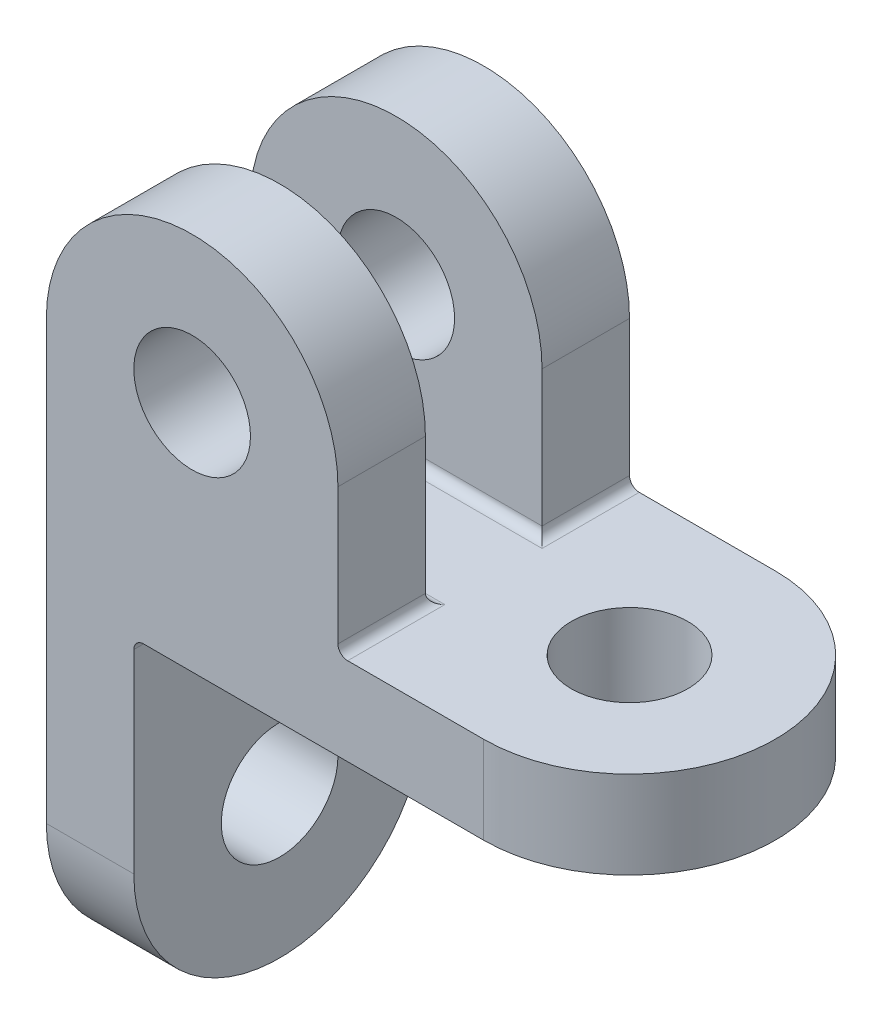
ISO-10303-21;
HEADER;
FILE_DESCRIPTION(('STEP AP214'),'2;1');
FILE_NAME('part.step','',(''),(''),'','','');
FILE_SCHEMA(('AUTOMOTIVE_DESIGN { 1 0 10303 214 1 1 1 1 }'));
ENDSEC;
DATA;
#1=APPLICATION_CONTEXT('core data for automotive mechanical design processes');
#2=APPLICATION_PROTOCOL_DEFINITION('international standard','automotive_design',2000,#1);
#3=PRODUCT_CONTEXT('',#1,'mechanical');
#4=PRODUCT('Part','Part','',(#3));
#5=PRODUCT_RELATED_PRODUCT_CATEGORY('part','',(#4));
#6=PRODUCT_DEFINITION_FORMATION('','',#4);
#7=PRODUCT_DEFINITION_CONTEXT('part definition',#1,'design');
#8=PRODUCT_DEFINITION('design','',#6,#7);
#9=PRODUCT_DEFINITION_SHAPE('','',#8);
#10=(LENGTH_UNIT() NAMED_UNIT(*) SI_UNIT(.MILLI.,.METRE.));
#11=(NAMED_UNIT(*) PLANE_ANGLE_UNIT() SI_UNIT($,.RADIAN.));
#12=(NAMED_UNIT(*) SI_UNIT($,.STERADIAN.) SOLID_ANGLE_UNIT());
#13=UNCERTAINTY_MEASURE_WITH_UNIT(LENGTH_MEASURE(1.E-05),#10,'distance_accuracy_value','');
#14=(GEOMETRIC_REPRESENTATION_CONTEXT(3) GLOBAL_UNCERTAINTY_ASSIGNED_CONTEXT((#13)) GLOBAL_UNIT_ASSIGNED_CONTEXT((#10,
#11,#12)) REPRESENTATION_CONTEXT('',''));
#15=CARTESIAN_POINT('',(0.,0.,0.));
#16=DIRECTION('',(0.,0.,1.));
#17=DIRECTION('',(1.,0.,0.));
#18=AXIS2_PLACEMENT_3D('',#15,#16,#17);
#19=CARTESIAN_POINT('',(0.,15.,0.));
#20=DIRECTION('',(-1.,0.,0.));
#21=DIRECTION('',(0.,-1.,0.));
#22=AXIS2_PLACEMENT_3D('',#19,#20,#21);
#23=CYLINDRICAL_SURFACE('',#22,15.);
#24=DIRECTION('',(-1.,0.,0.));
#25=VECTOR('',#24,1.);
#26=CARTESIAN_POINT('',(0.,15.,15.));
#27=LINE('',#26,#25);
#28=CARTESIAN_POINT('',(0.,15.,15.));
#29=VERTEX_POINT('',#28);
#30=CARTESIAN_POINT('',(9.,15.,15.));
#31=VERTEX_POINT('',#30);
#32=EDGE_CURVE('E293',#29,#31,#27,.F.);
#33=ORIENTED_EDGE('',*,*,#32,.F.);
#34=CARTESIAN_POINT('',(0.,15.,0.));
#35=DIRECTION('',(-1.,0.,0.));
#36=DIRECTION('',(0.,0.,1.));
#37=AXIS2_PLACEMENT_3D('',#34,#35,#36);
#38=CIRCLE('',#37,15.);
#39=CARTESIAN_POINT('',(0.,15.,-15.));
#40=VERTEX_POINT('',#39);
#41=EDGE_CURVE('E299',#40,#29,#38,.T.);
#42=ORIENTED_EDGE('',*,*,#41,.F.);
#43=DIRECTION('',(1.,0.,0.));
#44=VECTOR('',#43,1.);
#45=CARTESIAN_POINT('',(0.,15.,-15.));
#46=LINE('',#45,#44);
#47=CARTESIAN_POINT('',(9.,15.,-15.));
#48=VERTEX_POINT('',#47);
#49=EDGE_CURVE('E175',#48,#40,#46,.F.);
#50=ORIENTED_EDGE('',*,*,#49,.F.);
#51=CARTESIAN_POINT('',(9.,15.,0.));
#52=DIRECTION('',(1.,0.,0.));
#53=DIRECTION('',(0.,1.,0.));
#54=AXIS2_PLACEMENT_3D('',#51,#52,#53);
#55=CIRCLE('',#54,15.);
#56=EDGE_CURVE('E302',#31,#48,#55,.T.);
#57=ORIENTED_EDGE('',*,*,#56,.F.);
#58=EDGE_LOOP('',(#33,#42,#50,#57));
#59=FACE_BOUND('',#58,.T.);
#60=ADVANCED_FACE('F49',(#59),#23,.T.);
#61=CARTESIAN_POINT('',(45.,36.,0.));
#62=DIRECTION('',(0.,-1.,0.));
#63=DIRECTION('',(1.,0.,0.));
#64=AXIS2_PLACEMENT_3D('',#61,#62,#63);
#65=CYLINDRICAL_SURFACE('',#64,15.);
#66=DIRECTION('',(0.,-1.,0.));
#67=VECTOR('',#66,1.);
#68=CARTESIAN_POINT('',(45.,0.,15.));
#69=LINE('',#68,#67);
#70=CARTESIAN_POINT('',(45.,36.,15.));
#71=VERTEX_POINT('',#70);
#72=CARTESIAN_POINT('',(45.,45.,15.));
#73=VERTEX_POINT('',#72);
#74=EDGE_CURVE('E278',#71,#73,#69,.F.);
#75=ORIENTED_EDGE('',*,*,#74,.F.);
#76=CARTESIAN_POINT('',(45.,36.,0.));
#77=DIRECTION('',(0.,-1.,0.));
#78=DIRECTION('',(1.,0.,0.));
#79=AXIS2_PLACEMENT_3D('',#76,#77,#78);
#80=CIRCLE('',#79,15.);
#81=CARTESIAN_POINT('',(45.,36.,-15.));
#82=VERTEX_POINT('',#81);
#83=EDGE_CURVE('E286',#82,#71,#80,.T.);
#84=ORIENTED_EDGE('',*,*,#83,.F.);
#85=DIRECTION('',(0.,1.,0.));
#86=VECTOR('',#85,1.);
#87=CARTESIAN_POINT('',(45.,36.,-15.));
#88=LINE('',#87,#86);
#89=CARTESIAN_POINT('',(45.,45.,-15.));
#90=VERTEX_POINT('',#89);
#91=EDGE_CURVE('E282',#90,#82,#88,.F.);
#92=ORIENTED_EDGE('',*,*,#91,.F.);
#93=CARTESIAN_POINT('',(45.,45.,0.));
#94=DIRECTION('',(0.,1.,0.));
#95=DIRECTION('',(-1.,0.,0.));
#96=AXIS2_PLACEMENT_3D('',#93,#94,#95);
#97=CIRCLE('',#96,15.);
#98=EDGE_CURVE('E289',#73,#90,#97,.T.);
#99=ORIENTED_EDGE('',*,*,#98,.F.);
#100=EDGE_LOOP('',(#75,#84,#92,#99));
#101=FACE_BOUND('',#100,.T.);
#102=ADVANCED_FACE('F404',(#101),#65,.T.);
#103=CARTESIAN_POINT('',(0.,45.,15.));
#104=DIRECTION('',(0.,1.,0.));
#105=DIRECTION('',(-1.,0.,0.));
#106=AXIS2_PLACEMENT_3D('',#103,#104,#105);
#107=PLANE('',#106);
#108=CARTESIAN_POINT('',(45.,45.,0.));
#109=DIRECTION('',(0.,1.,0.));
#110=DIRECTION('',(0.,0.,1.));
#111=AXIS2_PLACEMENT_3D('',#108,#109,#110);
#112=CIRCLE('',#111,5.99999999999998);
#113=CARTESIAN_POINT('',(45.,45.,5.99999999999998));
#114=VERTEX_POINT('',#113);
#115=EDGE_CURVE('E312',#114,#114,#112,.T.);
#116=ORIENTED_EDGE('',*,*,#115,.F.);
#117=EDGE_LOOP('',(#116));
#118=FACE_BOUND('',#117,.T.);
#119=DIRECTION('',(0.,0.,1.));
#120=VECTOR('',#119,1.);
#121=CARTESIAN_POINT('',(31.,45.,15.));
#122=LINE('',#121,#120);
#123=CARTESIAN_POINT('',(31.,45.,-15.));
#124=VERTEX_POINT('',#123);
#125=CARTESIAN_POINT('',(31.,45.,-5.));
#126=VERTEX_POINT('',#125);
#127=EDGE_CURVE('E73',#124,#126,#122,.T.);
#128=ORIENTED_EDGE('',*,*,#127,.T.);
#129=DIRECTION('',(1.,0.,0.));
#130=VECTOR('',#129,1.);
#131=CARTESIAN_POINT('',(0.,45.,-5.));
#132=LINE('',#131,#130);
#133=CARTESIAN_POINT('',(0.,45.,-5.));
#134=VERTEX_POINT('',#133);
#135=EDGE_CURVE('E351',#126,#134,#132,.F.);
#136=ORIENTED_EDGE('',*,*,#135,.T.);
#137=DIRECTION('',(0.,0.,-1.));
#138=VECTOR('',#137,1.);
#139=CARTESIAN_POINT('',(0.,45.,15.));
#140=LINE('',#139,#138);
#141=CARTESIAN_POINT('',(0.,45.,5.));
#142=VERTEX_POINT('',#141);
#143=EDGE_CURVE('E267',#142,#134,#140,.T.);
#144=ORIENTED_EDGE('',*,*,#143,.F.);
#145=DIRECTION('',(1.,0.,0.));
#146=VECTOR('',#145,1.);
#147=CARTESIAN_POINT('',(0.,45.,5.));
#148=LINE('',#147,#146);
#149=CARTESIAN_POINT('',(31.,45.,5.));
#150=VERTEX_POINT('',#149);
#151=EDGE_CURVE('E347',#142,#150,#148,.T.);
#152=ORIENTED_EDGE('',*,*,#151,.T.);
#153=DIRECTION('',(0.,0.,-1.));
#154=VECTOR('',#153,1.);
#155=CARTESIAN_POINT('',(31.,45.,15.));
#156=LINE('',#155,#154);
#157=CARTESIAN_POINT('',(31.,45.,15.));
#158=VERTEX_POINT('',#157);
#159=EDGE_CURVE('E337',#150,#158,#156,.F.);
#160=ORIENTED_EDGE('',*,*,#159,.T.);
#161=DIRECTION('',(1.,0.,0.));
#162=VECTOR('',#161,1.);
#163=CARTESIAN_POINT('',(0.,45.,15.));
#164=LINE('',#163,#162);
#165=EDGE_CURVE('E261',#158,#73,#164,.T.);
#166=ORIENTED_EDGE('',*,*,#165,.T.);
#167=ORIENTED_EDGE('',*,*,#98,.T.);
#168=DIRECTION('',(1.,0.,0.));
#169=VECTOR('',#168,1.);
#170=CARTESIAN_POINT('',(0.,45.,-15.));
#171=LINE('',#170,#169);
#172=EDGE_CURVE('E179',#124,#90,#171,.T.);
#173=ORIENTED_EDGE('',*,*,#172,.F.);
#174=EDGE_LOOP('',(#128,#136,#144,#152,#160,#166,#167,#173));
#175=FACE_BOUND('',#174,.T.);
#176=ADVANCED_FACE('F378',(#118,#175),#107,.T.);
#177=CARTESIAN_POINT('',(9.,0.,15.));
#178=DIRECTION('',(1.,0.,0.));
#179=DIRECTION('',(0.,1.,0.));
#180=AXIS2_PLACEMENT_3D('',#177,#178,#179);
#181=PLANE('',#180);
#182=CARTESIAN_POINT('',(9.,15.,0.));
#183=DIRECTION('',(1.,0.,0.));
#184=DIRECTION('',(0.,0.,-1.));
#185=AXIS2_PLACEMENT_3D('',#182,#183,#184);
#186=CIRCLE('',#185,5.99999999999999);
#187=CARTESIAN_POINT('',(9.,15.,-5.99999999999999));
#188=VERTEX_POINT('',#187);
#189=EDGE_CURVE('E311',#188,#188,#186,.T.);
#190=ORIENTED_EDGE('',*,*,#189,.F.);
#191=EDGE_LOOP('',(#190));
#192=FACE_BOUND('',#191,.T.);
#193=DIRECTION('',(0.,-1.,0.));
#194=VECTOR('',#193,1.);
#195=CARTESIAN_POINT('',(9.,0.,-15.));
#196=LINE('',#195,#194);
#197=CARTESIAN_POINT('',(8.99999999999999,35.,-15.));
#198=VERTEX_POINT('',#197);
#199=EDGE_CURVE('E254',#198,#48,#196,.T.);
#200=ORIENTED_EDGE('',*,*,#199,.F.);
#201=DIRECTION('',(0.,0.,-1.));
#202=VECTOR('',#201,1.);
#203=CARTESIAN_POINT('',(8.99999999999999,35.,15.));
#204=LINE('',#203,#202);
#205=CARTESIAN_POINT('',(8.99999999999999,35.,15.));
#206=VERTEX_POINT('',#205);
#207=EDGE_CURVE('E316',#198,#206,#204,.F.);
#208=ORIENTED_EDGE('',*,*,#207,.T.);
#209=DIRECTION('',(0.,-1.,0.));
#210=VECTOR('',#209,1.);
#211=CARTESIAN_POINT('',(9.,0.,15.));
#212=LINE('',#211,#210);
#213=EDGE_CURVE('E178',#206,#31,#212,.T.);
#214=ORIENTED_EDGE('',*,*,#213,.T.);
#215=ORIENTED_EDGE('',*,*,#56,.T.);
#216=EDGE_LOOP('',(#200,#208,#214,#215));
#217=FACE_BOUND('',#216,.T.);
#218=ADVANCED_FACE('F421',(#192,#217),#181,.T.);
#219=CARTESIAN_POINT('',(0.,36.,15.));
#220=DIRECTION('',(0.,-1.,0.));
#221=DIRECTION('',(1.,0.,0.));
#222=AXIS2_PLACEMENT_3D('',#219,#220,#221);
#223=PLANE('',#222);
#224=CARTESIAN_POINT('',(45.,36.,0.));
#225=DIRECTION('',(0.,-1.,0.));
#226=DIRECTION('',(1.,0.,0.));
#227=AXIS2_PLACEMENT_3D('',#224,#225,#226);
#228=CIRCLE('',#227,5.99999999999998);
#229=CARTESIAN_POINT('',(51.,36.,0.));
#230=VERTEX_POINT('',#229);
#231=EDGE_CURVE('E307',#230,#230,#228,.T.);
#232=ORIENTED_EDGE('',*,*,#231,.F.);
#233=EDGE_LOOP('',(#232));
#234=FACE_BOUND('',#233,.T.);
#235=DIRECTION('',(-1.,0.,0.));
#236=VECTOR('',#235,1.);
#237=CARTESIAN_POINT('',(0.,36.,15.));
#238=LINE('',#237,#236);
#239=CARTESIAN_POINT('',(9.99999999999999,36.,15.));
#240=VERTEX_POINT('',#239);
#241=EDGE_CURVE('E257',#71,#240,#238,.T.);
#242=ORIENTED_EDGE('',*,*,#241,.T.);
#243=DIRECTION('',(0.,0.,-1.));
#244=VECTOR('',#243,1.);
#245=CARTESIAN_POINT('',(9.99999999999999,36.,-15.));
#246=LINE('',#245,#244);
#247=CARTESIAN_POINT('',(9.99999999999999,36.,-15.));
#248=VERTEX_POINT('',#247);
#249=EDGE_CURVE('E306',#240,#248,#246,.T.);
#250=ORIENTED_EDGE('',*,*,#249,.T.);
#251=DIRECTION('',(-1.,0.,0.));
#252=VECTOR('',#251,1.);
#253=CARTESIAN_POINT('',(0.,36.,-15.));
#254=LINE('',#253,#252);
#255=EDGE_CURVE('E270',#82,#248,#254,.T.);
#256=ORIENTED_EDGE('',*,*,#255,.F.);
#257=ORIENTED_EDGE('',*,*,#83,.T.);
#258=EDGE_LOOP('',(#242,#250,#256,#257));
#259=FACE_BOUND('',#258,.T.);
#260=ADVANCED_FACE('F424',(#234,#259),#223,.T.);
#261=CARTESIAN_POINT('',(0.,0.,15.));
#262=DIRECTION('',(-1.,0.,0.));
#263=DIRECTION('',(0.,0.,1.));
#264=AXIS2_PLACEMENT_3D('',#261,#262,#263);
#265=PLANE('',#264);
#266=CARTESIAN_POINT('',(0.,15.,0.));
#267=DIRECTION('',(-1.,0.,0.));
#268=DIRECTION('',(0.,0.,1.));
#269=AXIS2_PLACEMENT_3D('',#266,#267,#268);
#270=CIRCLE('',#269,5.99999999999999);
#271=CARTESIAN_POINT('',(0.,15.,5.99999999999999));
#272=VERTEX_POINT('',#271);
#273=EDGE_CURVE('E211',#272,#272,#270,.T.);
#274=ORIENTED_EDGE('',*,*,#273,.F.);
#275=EDGE_LOOP('',(#274));
#276=FACE_BOUND('',#275,.T.);
#277=DIRECTION('',(0.,1.,0.));
#278=VECTOR('',#277,1.);
#279=CARTESIAN_POINT('',(0.,0.,-15.));
#280=LINE('',#279,#278);
#281=CARTESIAN_POINT('',(0.,60.,-15.));
#282=VERTEX_POINT('',#281);
#283=EDGE_CURVE('E165',#40,#282,#280,.T.);
#284=ORIENTED_EDGE('',*,*,#283,.F.);
#285=ORIENTED_EDGE('',*,*,#41,.T.);
#286=DIRECTION('',(0.,1.,0.));
#287=VECTOR('',#286,1.);
#288=CARTESIAN_POINT('',(0.,0.,15.));
#289=LINE('',#288,#287);
#290=CARTESIAN_POINT('',(0.,60.,15.));
#291=VERTEX_POINT('',#290);
#292=EDGE_CURVE('E264',#29,#291,#289,.T.);
#293=ORIENTED_EDGE('',*,*,#292,.T.);
#294=DIRECTION('',(0.,0.,-1.));
#295=VECTOR('',#294,1.);
#296=CARTESIAN_POINT('',(0.,60.,15.));
#297=LINE('',#296,#295);
#298=CARTESIAN_POINT('',(0.,60.,6.));
#299=VERTEX_POINT('',#298);
#300=EDGE_CURVE('E250',#291,#299,#297,.T.);
#301=ORIENTED_EDGE('',*,*,#300,.T.);
#302=DIRECTION('',(0.,1.,0.));
#303=VECTOR('',#302,1.);
#304=CARTESIAN_POINT('',(0.,0.,6.));
#305=LINE('',#304,#303);
#306=CARTESIAN_POINT('',(0.,46.,6.));
#307=VERTEX_POINT('',#306);
#308=EDGE_CURVE('E243',#307,#299,#305,.T.);
#309=ORIENTED_EDGE('',*,*,#308,.F.);
#310=CARTESIAN_POINT('',(0.,46.,5.));
#311=DIRECTION('',(-1.,0.,0.));
#312=DIRECTION('',(0.,0.,1.));
#313=AXIS2_PLACEMENT_3D('',#310,#311,#312);
#314=CIRCLE('',#313,1.);
#315=EDGE_CURVE('E11',#307,#142,#314,.F.);
#316=ORIENTED_EDGE('',*,*,#315,.T.);
#317=ORIENTED_EDGE('',*,*,#143,.T.);
#318=CARTESIAN_POINT('',(0.,46.,-5.));
#319=DIRECTION('',(-1.,0.,0.));
#320=DIRECTION('',(0.,0.,1.));
#321=AXIS2_PLACEMENT_3D('',#318,#319,#320);
#322=CIRCLE('',#321,1.);
#323=CARTESIAN_POINT('',(0.,46.,-6.));
#324=VERTEX_POINT('',#323);
#325=EDGE_CURVE('E359',#134,#324,#322,.F.);
#326=ORIENTED_EDGE('',*,*,#325,.T.);
#327=DIRECTION('',(0.,1.,0.));
#328=VECTOR('',#327,1.);
#329=CARTESIAN_POINT('',(0.,0.,-6.));
#330=LINE('',#329,#328);
#331=CARTESIAN_POINT('',(0.,60.,-6.));
#332=VERTEX_POINT('',#331);
#333=EDGE_CURVE('E185',#324,#332,#330,.T.);
#334=ORIENTED_EDGE('',*,*,#333,.T.);
#335=DIRECTION('',(0.,0.,1.));
#336=VECTOR('',#335,1.);
#337=CARTESIAN_POINT('',(0.,60.,-15.));
#338=LINE('',#337,#336);
#339=EDGE_CURVE('E182',#282,#332,#338,.T.);
#340=ORIENTED_EDGE('',*,*,#339,.F.);
#341=EDGE_LOOP('',(#284,#285,#293,#301,#309,#316,#317,#326,#334,#340));
#342=FACE_BOUND('',#341,.T.);
#343=ADVANCED_FACE('F183',(#276,#342),#265,.T.);
#344=CARTESIAN_POINT('',(0.,0.,15.));
#345=DIRECTION('',(0.,0.,1.));
#346=DIRECTION('',(1.,0.,0.));
#347=AXIS2_PLACEMENT_3D('',#344,#345,#346);
#348=PLANE('',#347);
#349=ORIENTED_EDGE('',*,*,#292,.F.);
#350=ORIENTED_EDGE('',*,*,#32,.T.);
#351=ORIENTED_EDGE('',*,*,#213,.F.);
#352=CARTESIAN_POINT('',(9.99999999999999,35.,15.));
#353=DIRECTION('',(0.,0.,1.));
#354=DIRECTION('',(1.,0.,0.));
#355=AXIS2_PLACEMENT_3D('',#352,#353,#354);
#356=CIRCLE('',#355,1.);
#357=EDGE_CURVE('E322',#206,#240,#356,.F.);
#358=ORIENTED_EDGE('',*,*,#357,.T.);
#359=ORIENTED_EDGE('',*,*,#241,.F.);
#360=ORIENTED_EDGE('',*,*,#74,.T.);
#361=ORIENTED_EDGE('',*,*,#165,.F.);
#362=CARTESIAN_POINT('',(31.,46.,15.));
#363=DIRECTION('',(0.,0.,1.));
#364=DIRECTION('',(1.,0.,0.));
#365=AXIS2_PLACEMENT_3D('',#362,#363,#364);
#366=CIRCLE('',#365,1.);
#367=CARTESIAN_POINT('',(30.,46.,15.));
#368=VERTEX_POINT('',#367);
#369=EDGE_CURVE('E340',#158,#368,#366,.F.);
#370=ORIENTED_EDGE('',*,*,#369,.T.);
#371=DIRECTION('',(0.,-1.,0.));
#372=VECTOR('',#371,1.);
#373=CARTESIAN_POINT('',(30.,0.,15.));
#374=LINE('',#373,#372);
#375=CARTESIAN_POINT('',(30.,60.,15.));
#376=VERTEX_POINT('',#375);
#377=EDGE_CURVE('E231',#376,#368,#374,.T.);
#378=ORIENTED_EDGE('',*,*,#377,.F.);
#379=CARTESIAN_POINT('',(15.,60.,15.));
#380=DIRECTION('',(0.,0.,1.));
#381=DIRECTION('',(1.,0.,0.));
#382=AXIS2_PLACEMENT_3D('',#379,#380,#381);
#383=CIRCLE('',#382,15.);
#384=EDGE_CURVE('E226',#291,#376,#383,.F.);
#385=ORIENTED_EDGE('',*,*,#384,.F.);
#386=EDGE_LOOP('',(#349,#350,#351,#358,#359,#360,#361,#370,#378,#385));
#387=FACE_BOUND('',#386,.T.);
#388=CARTESIAN_POINT('',(15.,60.,15.));
#389=DIRECTION('',(0.,0.,1.));
#390=DIRECTION('',(1.,0.,0.));
#391=AXIS2_PLACEMENT_3D('',#388,#389,#390);
#392=CIRCLE('',#391,6.);
#393=CARTESIAN_POINT('',(21.,60.,15.));
#394=VERTEX_POINT('',#393);
#395=EDGE_CURVE('E222',#394,#394,#392,.T.);
#396=ORIENTED_EDGE('',*,*,#395,.F.);
#397=EDGE_LOOP('',(#396));
#398=FACE_BOUND('',#397,.T.);
#399=ADVANCED_FACE('F434',(#387,#398),#348,.T.);
#400=CARTESIAN_POINT('',(0.,0.,-15.));
#401=DIRECTION('',(0.,0.,1.));
#402=DIRECTION('',(1.,0.,0.));
#403=AXIS2_PLACEMENT_3D('',#400,#401,#402);
#404=PLANE('',#403);
#405=ORIENTED_EDGE('',*,*,#255,.T.);
#406=CARTESIAN_POINT('',(9.99999999999999,35.,-15.));
#407=DIRECTION('',(0.,0.,1.));
#408=DIRECTION('',(1.,0.,0.));
#409=AXIS2_PLACEMENT_3D('',#406,#407,#408);
#410=CIRCLE('',#409,1.);
#411=EDGE_CURVE('E319',#248,#198,#410,.T.);
#412=ORIENTED_EDGE('',*,*,#411,.T.);
#413=ORIENTED_EDGE('',*,*,#199,.T.);
#414=ORIENTED_EDGE('',*,*,#49,.T.);
#415=ORIENTED_EDGE('',*,*,#283,.T.);
#416=CARTESIAN_POINT('',(15.,60.,-15.));
#417=DIRECTION('',(0.,0.,1.));
#418=DIRECTION('',(1.,0.,0.));
#419=AXIS2_PLACEMENT_3D('',#416,#417,#418);
#420=CIRCLE('',#419,15.);
#421=CARTESIAN_POINT('',(30.,60.,-15.));
#422=VERTEX_POINT('',#421);
#423=EDGE_CURVE('E172',#282,#422,#420,.F.);
#424=ORIENTED_EDGE('',*,*,#423,.T.);
#425=DIRECTION('',(0.,-1.,0.));
#426=VECTOR('',#425,1.);
#427=CARTESIAN_POINT('',(30.,0.,-15.));
#428=LINE('',#427,#426);
#429=CARTESIAN_POINT('',(30.,46.,-15.));
#430=VERTEX_POINT('',#429);
#431=EDGE_CURVE('E191',#422,#430,#428,.T.);
#432=ORIENTED_EDGE('',*,*,#431,.T.);
#433=CARTESIAN_POINT('',(31.,46.,-15.));
#434=DIRECTION('',(0.,0.,1.));
#435=DIRECTION('',(1.,0.,0.));
#436=AXIS2_PLACEMENT_3D('',#433,#434,#435);
#437=CIRCLE('',#436,1.);
#438=EDGE_CURVE('E330',#430,#124,#437,.T.);
#439=ORIENTED_EDGE('',*,*,#438,.T.);
#440=ORIENTED_EDGE('',*,*,#172,.T.);
#441=ORIENTED_EDGE('',*,*,#91,.T.);
#442=EDGE_LOOP('',(#405,#412,#413,#414,#415,#424,#432,#439,#440,#441));
#443=FACE_BOUND('',#442,.T.);
#444=CARTESIAN_POINT('',(15.,60.,-15.));
#445=DIRECTION('',(0.,0.,1.));
#446=DIRECTION('',(1.,0.,0.));
#447=AXIS2_PLACEMENT_3D('',#444,#445,#446);
#448=CIRCLE('',#447,6.);
#449=CARTESIAN_POINT('',(21.,60.,-15.));
#450=VERTEX_POINT('',#449);
#451=EDGE_CURVE('E196',#450,#450,#448,.T.);
#452=ORIENTED_EDGE('',*,*,#451,.T.);
#453=EDGE_LOOP('',(#452));
#454=FACE_BOUND('',#453,.T.);
#455=ADVANCED_FACE('F168',(#443,#454),#404,.F.);
#456=CARTESIAN_POINT('',(15.,60.,15.));
#457=DIRECTION('',(0.,0.,-1.));
#458=DIRECTION('',(-1.,0.,0.));
#459=AXIS2_PLACEMENT_3D('',#456,#457,#458);
#460=CYLINDRICAL_SURFACE('',#459,15.);
#461=CARTESIAN_POINT('',(15.,60.,6.));
#462=DIRECTION('',(0.,0.,1.));
#463=DIRECTION('',(1.,0.,0.));
#464=AXIS2_PLACEMENT_3D('',#461,#462,#463);
#465=CIRCLE('',#464,15.);
#466=CARTESIAN_POINT('',(30.,60.,6.));
#467=VERTEX_POINT('',#466);
#468=EDGE_CURVE('E239',#299,#467,#465,.F.);
#469=ORIENTED_EDGE('',*,*,#468,.F.);
#470=ORIENTED_EDGE('',*,*,#300,.F.);
#471=ORIENTED_EDGE('',*,*,#384,.T.);
#472=DIRECTION('',(0.,0.,-1.));
#473=VECTOR('',#472,1.);
#474=CARTESIAN_POINT('',(30.,60.,15.));
#475=LINE('',#474,#473);
#476=EDGE_CURVE('E235',#376,#467,#475,.T.);
#477=ORIENTED_EDGE('',*,*,#476,.T.);
#478=EDGE_LOOP('',(#469,#470,#471,#477));
#479=FACE_BOUND('',#478,.T.);
#480=ADVANCED_FACE('F438',(#479),#460,.T.);
#481=CARTESIAN_POINT('',(15.,60.,15.));
#482=DIRECTION('',(0.,0.,-1.));
#483=DIRECTION('',(-1.,0.,0.));
#484=AXIS2_PLACEMENT_3D('',#481,#482,#483);
#485=CYLINDRICAL_SURFACE('',#484,6.);
#486=ORIENTED_EDGE('',*,*,#395,.T.);
#487=EDGE_LOOP('',(#486));
#488=FACE_BOUND('',#487,.T.);
#489=CARTESIAN_POINT('',(15.,60.,6.));
#490=DIRECTION('',(0.,0.,1.));
#491=DIRECTION('',(1.,0.,0.));
#492=AXIS2_PLACEMENT_3D('',#489,#490,#491);
#493=CIRCLE('',#492,6.);
#494=CARTESIAN_POINT('',(21.,60.,6.));
#495=VERTEX_POINT('',#494);
#496=EDGE_CURVE('E220',#495,#495,#493,.T.);
#497=ORIENTED_EDGE('',*,*,#496,.F.);
#498=EDGE_LOOP('',(#497));
#499=FACE_BOUND('',#498,.T.);
#500=ADVANCED_FACE('F442',(#488,#499),#485,.F.);
#501=CARTESIAN_POINT('',(30.,0.,15.));
#502=DIRECTION('',(1.,0.,0.));
#503=DIRECTION('',(0.,1.,0.));
#504=AXIS2_PLACEMENT_3D('',#501,#502,#503);
#505=PLANE('',#504);
#506=ORIENTED_EDGE('',*,*,#377,.T.);
#507=DIRECTION('',(0.,0.,-1.));
#508=VECTOR('',#507,1.);
#509=CARTESIAN_POINT('',(30.,46.,6.));
#510=LINE('',#509,#508);
#511=CARTESIAN_POINT('',(30.,46.,6.));
#512=VERTEX_POINT('',#511);
#513=EDGE_CURVE('E333',#368,#512,#510,.T.);
#514=ORIENTED_EDGE('',*,*,#513,.T.);
#515=DIRECTION('',(0.,-1.,0.));
#516=VECTOR('',#515,1.);
#517=CARTESIAN_POINT('',(30.,0.,6.));
#518=LINE('',#517,#516);
#519=EDGE_CURVE('E227',#467,#512,#518,.T.);
#520=ORIENTED_EDGE('',*,*,#519,.F.);
#521=ORIENTED_EDGE('',*,*,#476,.F.);
#522=EDGE_LOOP('',(#506,#514,#520,#521));
#523=FACE_BOUND('',#522,.T.);
#524=ADVANCED_FACE('F371',(#523),#505,.T.);
#525=CARTESIAN_POINT('',(0.,0.,6.));
#526=DIRECTION('',(0.,0.,1.));
#527=DIRECTION('',(1.,0.,0.));
#528=AXIS2_PLACEMENT_3D('',#525,#526,#527);
#529=PLANE('',#528);
#530=ORIENTED_EDGE('',*,*,#496,.T.);
#531=EDGE_LOOP('',(#530));
#532=FACE_BOUND('',#531,.T.);
#533=ORIENTED_EDGE('',*,*,#519,.T.);
#534=DIRECTION('',(1.,0.,0.));
#535=VECTOR('',#534,1.);
#536=CARTESIAN_POINT('',(0.,46.,6.));
#537=LINE('',#536,#535);
#538=EDGE_CURVE('E65',#512,#307,#537,.F.);
#539=ORIENTED_EDGE('',*,*,#538,.T.);
#540=ORIENTED_EDGE('',*,*,#308,.T.);
#541=ORIENTED_EDGE('',*,*,#468,.T.);
#542=EDGE_LOOP('',(#533,#539,#540,#541));
#543=FACE_BOUND('',#542,.T.);
#544=ADVANCED_FACE('F373',(#532,#543),#529,.F.);
#545=CARTESIAN_POINT('',(15.,60.,-15.));
#546=DIRECTION('',(0.,0.,1.));
#547=DIRECTION('',(1.,0.,0.));
#548=AXIS2_PLACEMENT_3D('',#545,#546,#547);
#549=CYLINDRICAL_SURFACE('',#548,15.);
#550=CARTESIAN_POINT('',(15.,60.,-6.));
#551=DIRECTION('',(0.,0.,1.));
#552=DIRECTION('',(1.,0.,0.));
#553=AXIS2_PLACEMENT_3D('',#550,#551,#552);
#554=CIRCLE('',#553,15.);
#555=CARTESIAN_POINT('',(30.,60.,-6.));
#556=VERTEX_POINT('',#555);
#557=EDGE_CURVE('E210',#332,#556,#554,.F.);
#558=ORIENTED_EDGE('',*,*,#557,.T.);
#559=DIRECTION('',(0.,0.,1.));
#560=VECTOR('',#559,1.);
#561=CARTESIAN_POINT('',(30.,60.,-15.));
#562=LINE('',#561,#560);
#563=EDGE_CURVE('E190',#422,#556,#562,.T.);
#564=ORIENTED_EDGE('',*,*,#563,.F.);
#565=ORIENTED_EDGE('',*,*,#423,.F.);
#566=ORIENTED_EDGE('',*,*,#339,.T.);
#567=EDGE_LOOP('',(#558,#564,#565,#566));
#568=FACE_BOUND('',#567,.T.);
#569=ADVANCED_FACE('F193',(#568),#549,.T.);
#570=CARTESIAN_POINT('',(30.,0.,-15.));
#571=DIRECTION('',(-1.,0.,0.));
#572=DIRECTION('',(0.,-1.,0.));
#573=AXIS2_PLACEMENT_3D('',#570,#571,#572);
#574=PLANE('',#573);
#575=DIRECTION('',(0.,-1.,0.));
#576=VECTOR('',#575,1.);
#577=CARTESIAN_POINT('',(30.,0.,-6.));
#578=LINE('',#577,#576);
#579=CARTESIAN_POINT('',(30.,46.,-6.));
#580=VERTEX_POINT('',#579);
#581=EDGE_CURVE('E202',#556,#580,#578,.T.);
#582=ORIENTED_EDGE('',*,*,#581,.T.);
#583=DIRECTION('',(0.,0.,1.));
#584=VECTOR('',#583,1.);
#585=CARTESIAN_POINT('',(30.,46.,-15.));
#586=LINE('',#585,#584);
#587=EDGE_CURVE('E327',#580,#430,#586,.F.);
#588=ORIENTED_EDGE('',*,*,#587,.T.);
#589=ORIENTED_EDGE('',*,*,#431,.F.);
#590=ORIENTED_EDGE('',*,*,#563,.T.);
#591=EDGE_LOOP('',(#582,#588,#589,#590));
#592=FACE_BOUND('',#591,.T.);
#593=ADVANCED_FACE('F387',(#592),#574,.F.);
#594=CARTESIAN_POINT('',(15.,60.,-15.));
#595=DIRECTION('',(0.,0.,1.));
#596=DIRECTION('',(1.,0.,0.));
#597=AXIS2_PLACEMENT_3D('',#594,#595,#596);
#598=CYLINDRICAL_SURFACE('',#597,6.);
#599=ORIENTED_EDGE('',*,*,#451,.F.);
#600=EDGE_LOOP('',(#599));
#601=FACE_BOUND('',#600,.T.);
#602=CARTESIAN_POINT('',(15.,60.,-6.));
#603=DIRECTION('',(0.,0.,1.));
#604=DIRECTION('',(1.,0.,0.));
#605=AXIS2_PLACEMENT_3D('',#602,#603,#604);
#606=CIRCLE('',#605,6.);
#607=CARTESIAN_POINT('',(21.,60.,-6.));
#608=VERTEX_POINT('',#607);
#609=EDGE_CURVE('E206',#608,#608,#606,.T.);
#610=ORIENTED_EDGE('',*,*,#609,.T.);
#611=EDGE_LOOP('',(#610));
#612=FACE_BOUND('',#611,.T.);
#613=ADVANCED_FACE('F454',(#601,#612),#598,.F.);
#614=CARTESIAN_POINT('',(0.,0.,-6.));
#615=DIRECTION('',(0.,0.,1.));
#616=DIRECTION('',(1.,0.,0.));
#617=AXIS2_PLACEMENT_3D('',#614,#615,#616);
#618=PLANE('',#617);
#619=ORIENTED_EDGE('',*,*,#609,.F.);
#620=EDGE_LOOP('',(#619));
#621=FACE_BOUND('',#620,.T.);
#622=ORIENTED_EDGE('',*,*,#333,.F.);
#623=DIRECTION('',(1.,0.,0.));
#624=VECTOR('',#623,1.);
#625=CARTESIAN_POINT('',(31.,46.,-6.));
#626=LINE('',#625,#624);
#627=EDGE_CURVE('E343',#324,#580,#626,.T.);
#628=ORIENTED_EDGE('',*,*,#627,.T.);
#629=ORIENTED_EDGE('',*,*,#581,.F.);
#630=ORIENTED_EDGE('',*,*,#557,.F.);
#631=EDGE_LOOP('',(#622,#628,#629,#630));
#632=FACE_BOUND('',#631,.T.);
#633=ADVANCED_FACE('F384',(#621,#632),#618,.T.);
#634=CARTESIAN_POINT('',(9.,15.,0.));
#635=DIRECTION('',(1.,0.,0.));
#636=DIRECTION('',(0.,0.,-1.));
#637=AXIS2_PLACEMENT_3D('',#634,#635,#636);
#638=CYLINDRICAL_SURFACE('',#637,5.99999999999999);
#639=ORIENTED_EDGE('',*,*,#273,.T.);
#640=EDGE_LOOP('',(#639));
#641=FACE_BOUND('',#640,.T.);
#642=ORIENTED_EDGE('',*,*,#189,.T.);
#643=EDGE_LOOP('',(#642));
#644=FACE_BOUND('',#643,.T.);
#645=ADVANCED_FACE('F463',(#641,#644),#638,.F.);
#646=CARTESIAN_POINT('',(45.,45.,0.));
#647=DIRECTION('',(0.,1.,0.));
#648=DIRECTION('',(0.,0.,1.));
#649=AXIS2_PLACEMENT_3D('',#646,#647,#648);
#650=CYLINDRICAL_SURFACE('',#649,5.99999999999998);
#651=ORIENTED_EDGE('',*,*,#231,.T.);
#652=EDGE_LOOP('',(#651));
#653=FACE_BOUND('',#652,.T.);
#654=ORIENTED_EDGE('',*,*,#115,.T.);
#655=EDGE_LOOP('',(#654));
#656=FACE_BOUND('',#655,.T.);
#657=ADVANCED_FACE('F400',(#653,#656),#650,.F.);
#658=CARTESIAN_POINT('',(9.99999999999999,35.,15.));
#659=DIRECTION('',(0.,0.,1.));
#660=DIRECTION('',(1.,0.,0.));
#661=AXIS2_PLACEMENT_3D('',#658,#659,#660);
#662=CYLINDRICAL_SURFACE('',#661,1.);
#663=ORIENTED_EDGE('',*,*,#357,.F.);
#664=ORIENTED_EDGE('',*,*,#207,.F.);
#665=ORIENTED_EDGE('',*,*,#411,.F.);
#666=ORIENTED_EDGE('',*,*,#249,.F.);
#667=EDGE_LOOP('',(#663,#664,#665,#666));
#668=FACE_BOUND('',#667,.T.);
#669=ADVANCED_FACE('F392',(#668),#662,.F.);
#670=CARTESIAN_POINT('',(31.,46.,15.));
#671=DIRECTION('',(0.,0.,1.));
#672=DIRECTION('',(1.,0.,0.));
#673=AXIS2_PLACEMENT_3D('',#670,#671,#672);
#674=CYLINDRICAL_SURFACE('',#673,1.);
#675=ORIENTED_EDGE('',*,*,#438,.F.);
#676=ORIENTED_EDGE('',*,*,#587,.F.);
#677=CARTESIAN_POINT('',(31.,46.,-5.));
#678=DIRECTION('',(-0.707106781186547,0.,0.707106781186547));
#679=DIRECTION('',(0.707106781186547,0.,0.707106781186547));
#680=AXIS2_PLACEMENT_3D('',#677,#678,#679);
#681=ELLIPSE('',#680,1.41421356237309,1.);
#682=EDGE_CURVE('E356',#580,#126,#681,.T.);
#683=ORIENTED_EDGE('',*,*,#682,.T.);
#684=ORIENTED_EDGE('',*,*,#127,.F.);
#685=EDGE_LOOP('',(#675,#676,#683,#684));
#686=FACE_BOUND('',#685,.T.);
#687=ADVANCED_FACE('F390',(#686),#674,.F.);
#688=CARTESIAN_POINT('',(31.,46.,15.));
#689=DIRECTION('',(0.,0.,1.));
#690=DIRECTION('',(1.,0.,0.));
#691=AXIS2_PLACEMENT_3D('',#688,#689,#690);
#692=CYLINDRICAL_SURFACE('',#691,1.);
#693=ORIENTED_EDGE('',*,*,#369,.F.);
#694=ORIENTED_EDGE('',*,*,#159,.F.);
#695=CARTESIAN_POINT('',(31.,46.,5.));
#696=DIRECTION('',(0.707106781186547,0.,0.707106781186547));
#697=DIRECTION('',(-0.707106781186547,0.,0.707106781186547));
#698=AXIS2_PLACEMENT_3D('',#695,#696,#697);
#699=ELLIPSE('',#698,1.41421356237309,1.);
#700=EDGE_CURVE('E58',#150,#512,#699,.F.);
#701=ORIENTED_EDGE('',*,*,#700,.T.);
#702=ORIENTED_EDGE('',*,*,#513,.F.);
#703=EDGE_LOOP('',(#693,#694,#701,#702));
#704=FACE_BOUND('',#703,.T.);
#705=ADVANCED_FACE('F366',(#704),#692,.F.);
#706=CARTESIAN_POINT('',(0.,46.,-5.));
#707=DIRECTION('',(-1.,0.,0.));
#708=DIRECTION('',(0.,-1.,0.));
#709=AXIS2_PLACEMENT_3D('',#706,#707,#708);
#710=CYLINDRICAL_SURFACE('',#709,1.);
#711=ORIENTED_EDGE('',*,*,#325,.F.);
#712=ORIENTED_EDGE('',*,*,#135,.F.);
#713=ORIENTED_EDGE('',*,*,#682,.F.);
#714=ORIENTED_EDGE('',*,*,#627,.F.);
#715=EDGE_LOOP('',(#711,#712,#713,#714));
#716=FACE_BOUND('',#715,.T.);
#717=ADVANCED_FACE('F381',(#716),#710,.F.);
#718=CARTESIAN_POINT('',(0.,46.,5.));
#719=DIRECTION('',(1.,0.,0.));
#720=DIRECTION('',(0.,1.,0.));
#721=AXIS2_PLACEMENT_3D('',#718,#719,#720);
#722=CYLINDRICAL_SURFACE('',#721,1.);
#723=ORIENTED_EDGE('',*,*,#315,.F.);
#724=ORIENTED_EDGE('',*,*,#538,.F.);
#725=ORIENTED_EDGE('',*,*,#700,.F.);
#726=ORIENTED_EDGE('',*,*,#151,.F.);
#727=EDGE_LOOP('',(#723,#724,#725,#726));
#728=FACE_BOUND('',#727,.T.);
#729=ADVANCED_FACE('F51',(#728),#722,.F.);
#730=CLOSED_SHELL('',(#60,#102,#176,#218,#260,#343,#399,#455,#480,#500,#524,#544,#569,#593,#613,
#633,#645,#657,#669,#687,#705,#717,#729));
#731=MANIFOLD_SOLID_BREP('B2',#730);
#732=ADVANCED_BREP_SHAPE_REPRESENTATION('',(#18,#731),#14);
#733=SHAPE_DEFINITION_REPRESENTATION(#9,#732);
ENDSEC;
END-ISO-10303-21;
